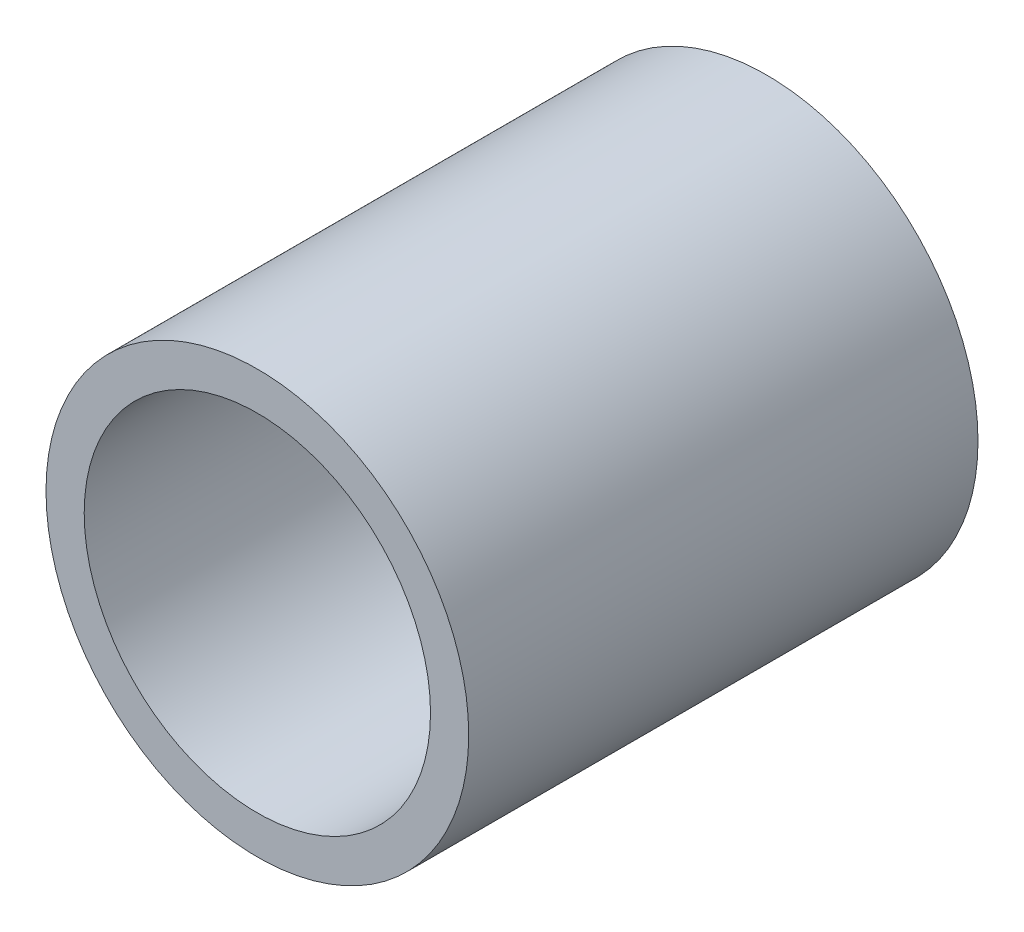
ISO-10303-21;
HEADER;
FILE_DESCRIPTION(('STEP AP214'),'2;1');
FILE_NAME('part.step','',(''),(''),'','','');
FILE_SCHEMA(('AUTOMOTIVE_DESIGN { 1 0 10303 214 1 1 1 1 }'));
ENDSEC;
DATA;
#1=APPLICATION_CONTEXT('core data for automotive mechanical design processes');
#2=APPLICATION_PROTOCOL_DEFINITION('international standard','automotive_design',2000,#1);
#3=PRODUCT_CONTEXT('',#1,'mechanical');
#4=PRODUCT('Part','Part','',(#3));
#5=PRODUCT_RELATED_PRODUCT_CATEGORY('part','',(#4));
#6=PRODUCT_DEFINITION_FORMATION('','',#4);
#7=PRODUCT_DEFINITION_CONTEXT('part definition',#1,'design');
#8=PRODUCT_DEFINITION('design','',#6,#7);
#9=PRODUCT_DEFINITION_SHAPE('','',#8);
#10=(LENGTH_UNIT() NAMED_UNIT(*) SI_UNIT(.MILLI.,.METRE.));
#11=(NAMED_UNIT(*) PLANE_ANGLE_UNIT() SI_UNIT($,.RADIAN.));
#12=(NAMED_UNIT(*) SI_UNIT($,.STERADIAN.) SOLID_ANGLE_UNIT());
#13=UNCERTAINTY_MEASURE_WITH_UNIT(LENGTH_MEASURE(1.E-05),#10,'distance_accuracy_value','');
#14=(GEOMETRIC_REPRESENTATION_CONTEXT(3) GLOBAL_UNCERTAINTY_ASSIGNED_CONTEXT((#13)) GLOBAL_UNIT_ASSIGNED_CONTEXT((#10,
#11,#12)) REPRESENTATION_CONTEXT('',''));
#15=CARTESIAN_POINT('',(0.,0.,0.));
#16=DIRECTION('',(0.,0.,1.));
#17=DIRECTION('',(1.,0.,0.));
#18=AXIS2_PLACEMENT_3D('',#15,#16,#17);
#19=CARTESIAN_POINT('',(0.,0.,50.8));
#20=DIRECTION('',(0.,0.,-1.));
#21=DIRECTION('',(-1.,0.,0.));
#22=AXIS2_PLACEMENT_3D('',#19,#20,#21);
#23=CYLINDRICAL_SURFACE('',#22,17.272);
#24=CARTESIAN_POINT('',(0.,0.,50.8));
#25=DIRECTION('',(0.,0.,1.));
#26=DIRECTION('',(1.,0.,0.));
#27=AXIS2_PLACEMENT_3D('',#24,#25,#26);
#28=CIRCLE('',#27,17.272);
#29=CARTESIAN_POINT('',(17.272,0.,50.8));
#30=VERTEX_POINT('',#29);
#31=EDGE_CURVE('E42',#30,#30,#28,.T.);
#32=ORIENTED_EDGE('',*,*,#31,.T.);
#33=EDGE_LOOP('',(#32));
#34=FACE_BOUND('',#33,.T.);
#35=CARTESIAN_POINT('',(0.,0.,0.));
#36=DIRECTION('',(0.,0.,1.));
#37=DIRECTION('',(1.,0.,0.));
#38=AXIS2_PLACEMENT_3D('',#35,#36,#37);
#39=CIRCLE('',#38,17.272);
#40=CARTESIAN_POINT('',(17.272,0.,0.));
#41=VERTEX_POINT('',#40);
#42=EDGE_CURVE('E50',#41,#41,#39,.T.);
#43=ORIENTED_EDGE('',*,*,#42,.F.);
#44=EDGE_LOOP('',(#43));
#45=FACE_BOUND('',#44,.T.);
#46=ADVANCED_FACE('F34',(#34,#45),#23,.F.);
#47=CARTESIAN_POINT('',(0.,0.,50.8));
#48=DIRECTION('',(0.,0.,-1.));
#49=DIRECTION('',(-1.,0.,0.));
#50=AXIS2_PLACEMENT_3D('',#47,#48,#49);
#51=CYLINDRICAL_SURFACE('',#50,21.082);
#52=CARTESIAN_POINT('',(0.,0.,50.8));
#53=DIRECTION('',(0.,0.,1.));
#54=DIRECTION('',(1.,0.,0.));
#55=AXIS2_PLACEMENT_3D('',#52,#53,#54);
#56=CIRCLE('',#55,21.082);
#57=CARTESIAN_POINT('',(21.082,0.,50.8));
#58=VERTEX_POINT('',#57);
#59=EDGE_CURVE('E10',#58,#58,#56,.T.);
#60=ORIENTED_EDGE('',*,*,#59,.F.);
#61=EDGE_LOOP('',(#60));
#62=FACE_BOUND('',#61,.T.);
#63=CARTESIAN_POINT('',(0.,0.,0.));
#64=DIRECTION('',(0.,0.,1.));
#65=DIRECTION('',(1.,0.,0.));
#66=AXIS2_PLACEMENT_3D('',#63,#64,#65);
#67=CIRCLE('',#66,21.082);
#68=CARTESIAN_POINT('',(21.082,0.,0.));
#69=VERTEX_POINT('',#68);
#70=EDGE_CURVE('E37',#69,#69,#67,.T.);
#71=ORIENTED_EDGE('',*,*,#70,.T.);
#72=EDGE_LOOP('',(#71));
#73=FACE_BOUND('',#72,.T.);
#74=ADVANCED_FACE('F61',(#62,#73),#51,.T.);
#75=CARTESIAN_POINT('',(0.,0.,50.8));
#76=DIRECTION('',(0.,0.,1.));
#77=DIRECTION('',(1.,0.,0.));
#78=AXIS2_PLACEMENT_3D('',#75,#76,#77);
#79=PLANE('',#78);
#80=ORIENTED_EDGE('',*,*,#31,.F.);
#81=EDGE_LOOP('',(#80));
#82=FACE_BOUND('',#81,.T.);
#83=ORIENTED_EDGE('',*,*,#59,.T.);
#84=EDGE_LOOP('',(#83));
#85=FACE_BOUND('',#84,.T.);
#86=ADVANCED_FACE('F65',(#82,#85),#79,.T.);
#87=CARTESIAN_POINT('',(0.,0.,0.));
#88=DIRECTION('',(0.,0.,1.));
#89=DIRECTION('',(1.,0.,0.));
#90=AXIS2_PLACEMENT_3D('',#87,#88,#89);
#91=PLANE('',#90);
#92=ORIENTED_EDGE('',*,*,#42,.T.);
#93=EDGE_LOOP('',(#92));
#94=FACE_BOUND('',#93,.T.);
#95=ORIENTED_EDGE('',*,*,#70,.F.);
#96=EDGE_LOOP('',(#95));
#97=FACE_BOUND('',#96,.T.);
#98=ADVANCED_FACE('F63',(#94,#97),#91,.F.);
#99=CLOSED_SHELL('',(#46,#74,#86,#98));
#100=MANIFOLD_SOLID_BREP('B2',#99);
#101=ADVANCED_BREP_SHAPE_REPRESENTATION('',(#18,#100),#14);
#102=SHAPE_DEFINITION_REPRESENTATION(#9,#101);
ENDSEC;
END-ISO-10303-21;
